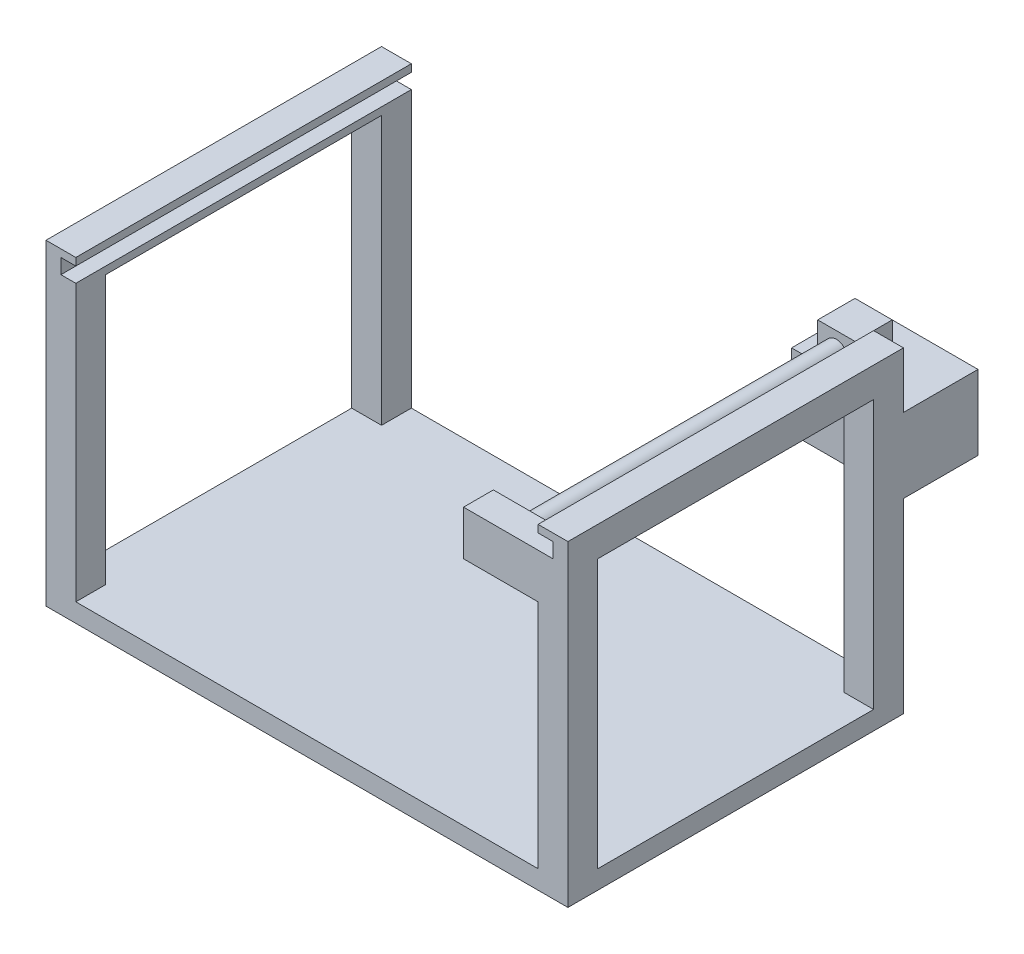
ISO-10303-21;
HEADER;
FILE_DESCRIPTION(('STEP AP214'),'2;1');
FILE_NAME('part.step','',(''),(''),'','','');
FILE_SCHEMA(('AUTOMOTIVE_DESIGN { 1 0 10303 214 1 1 1 1 }'));
ENDSEC;
DATA;
#1=APPLICATION_CONTEXT('core data for automotive mechanical design processes');
#2=APPLICATION_PROTOCOL_DEFINITION('international standard','automotive_design',2000,#1);
#3=PRODUCT_CONTEXT('',#1,'mechanical');
#4=PRODUCT('Part','Part','',(#3));
#5=PRODUCT_RELATED_PRODUCT_CATEGORY('part','',(#4));
#6=PRODUCT_DEFINITION_FORMATION('','',#4);
#7=PRODUCT_DEFINITION_CONTEXT('part definition',#1,'design');
#8=PRODUCT_DEFINITION('design','',#6,#7);
#9=PRODUCT_DEFINITION_SHAPE('','',#8);
#10=(LENGTH_UNIT() NAMED_UNIT(*) SI_UNIT(.MILLI.,.METRE.));
#11=(NAMED_UNIT(*) PLANE_ANGLE_UNIT() SI_UNIT($,.RADIAN.));
#12=(NAMED_UNIT(*) SI_UNIT($,.STERADIAN.) SOLID_ANGLE_UNIT());
#13=UNCERTAINTY_MEASURE_WITH_UNIT(LENGTH_MEASURE(1.E-05),#10,'distance_accuracy_value','');
#14=(GEOMETRIC_REPRESENTATION_CONTEXT(3) GLOBAL_UNCERTAINTY_ASSIGNED_CONTEXT((#13)) GLOBAL_UNIT_ASSIGNED_CONTEXT((#10,
#11,#12)) REPRESENTATION_CONTEXT('',''));
#15=CARTESIAN_POINT('',(0.,0.,0.));
#16=DIRECTION('',(0.,0.,1.));
#17=DIRECTION('',(1.,0.,0.));
#18=AXIS2_PLACEMENT_3D('',#15,#16,#17);
#19=CARTESIAN_POINT('',(132.,85.,-90.));
#20=DIRECTION('',(1.,0.,0.));
#21=DIRECTION('',(0.,0.,-1.));
#22=AXIS2_PLACEMENT_3D('',#19,#20,#21);
#23=PLANE('',#22);
#24=DIRECTION('',(0.,-1.,0.));
#25=VECTOR('',#24,1.);
#26=CARTESIAN_POINT('',(132.,79.,-8.));
#27=LINE('',#26,#25);
#28=CARTESIAN_POINT('',(132.,79.,-8.));
#29=VERTEX_POINT('',#28);
#30=CARTESIAN_POINT('',(132.,77.,-8.));
#31=VERTEX_POINT('',#30);
#32=EDGE_CURVE('E297',#29,#31,#27,.T.);
#33=ORIENTED_EDGE('',*,*,#32,.F.);
#34=DIRECTION('',(0.,0.,1.));
#35=VECTOR('',#34,1.);
#36=CARTESIAN_POINT('',(132.,79.,-95.6568542494924));
#37=LINE('',#36,#35);
#38=CARTESIAN_POINT('',(132.,79.,-90.));
#39=VERTEX_POINT('',#38);
#40=EDGE_CURVE('E411',#39,#29,#37,.T.);
#41=ORIENTED_EDGE('',*,*,#40,.F.);
#42=DIRECTION('',(0.,-1.,0.));
#43=VECTOR('',#42,1.);
#44=CARTESIAN_POINT('',(132.,85.,-90.));
#45=LINE('',#44,#43);
#46=CARTESIAN_POINT('',(132.,70.,-90.));
#47=VERTEX_POINT('',#46);
#48=EDGE_CURVE('E471',#39,#47,#45,.T.);
#49=ORIENTED_EDGE('',*,*,#48,.T.);
#50=CARTESIAN_POINT('',(132.,50.,-90.));
#51=VERTEX_POINT('',#50);
#52=EDGE_CURVE('E624',#47,#51,#45,.T.);
#53=ORIENTED_EDGE('',*,*,#52,.T.);
#54=CARTESIAN_POINT('',(132.,5.,-90.));
#55=VERTEX_POINT('',#54);
#56=EDGE_CURVE('E466',#51,#55,#45,.T.);
#57=ORIENTED_EDGE('',*,*,#56,.T.);
#58=DIRECTION('',(0.,0.,1.));
#59=VECTOR('',#58,1.);
#60=CARTESIAN_POINT('',(132.,5.,-90.));
#61=LINE('',#60,#59);
#62=CARTESIAN_POINT('',(132.,5.,-82.));
#63=VERTEX_POINT('',#62);
#64=EDGE_CURVE('E449',#55,#63,#61,.T.);
#65=ORIENTED_EDGE('',*,*,#64,.T.);
#66=DIRECTION('',(0.,-1.,0.));
#67=VECTOR('',#66,1.);
#68=CARTESIAN_POINT('',(132.,85.,-82.));
#69=LINE('',#68,#67);
#70=CARTESIAN_POINT('',(132.,77.,-82.));
#71=VERTEX_POINT('',#70);
#72=EDGE_CURVE('E464',#71,#63,#69,.T.);
#73=ORIENTED_EDGE('',*,*,#72,.F.);
#74=DIRECTION('',(0.,0.,-1.));
#75=VECTOR('',#74,1.);
#76=CARTESIAN_POINT('',(132.,77.,0.002000000000002));
#77=LINE('',#76,#75);
#78=EDGE_CURVE('E421',#31,#71,#77,.T.);
#79=ORIENTED_EDGE('',*,*,#78,.F.);
#80=EDGE_LOOP('',(#33,#41,#49,#53,#57,#65,#73,#79));
#81=FACE_BOUND('',#80,.T.);
#82=ADVANCED_FACE('F35',(#81),#23,.F.);
#83=CARTESIAN_POINT('',(0.,0.,-90.));
#84=DIRECTION('',(0.,0.,1.));
#85=DIRECTION('',(1.,0.,0.));
#86=AXIS2_PLACEMENT_3D('',#83,#84,#85);
#87=PLANE('',#86);
#88=DIRECTION('',(-1.,0.,0.));
#89=VECTOR('',#88,1.);
#90=CARTESIAN_POINT('',(140.,50.,-90.));
#91=LINE('',#90,#89);
#92=CARTESIAN_POINT('',(140.,50.,-90.));
#93=VERTEX_POINT('',#92);
#94=EDGE_CURVE('E350',#93,#51,#91,.T.);
#95=ORIENTED_EDGE('',*,*,#94,.F.);
#96=DIRECTION('',(0.,1.,0.));
#97=VECTOR('',#96,1.);
#98=CARTESIAN_POINT('',(140.,0.,-90.));
#99=LINE('',#98,#97);
#100=CARTESIAN_POINT('',(140.,0.,-90.));
#101=VERTEX_POINT('',#100);
#102=EDGE_CURVE('E515',#101,#93,#99,.T.);
#103=ORIENTED_EDGE('',*,*,#102,.F.);
#104=DIRECTION('',(1.,0.,0.));
#105=VECTOR('',#104,1.);
#106=CARTESIAN_POINT('',(0.,0.,-90.));
#107=LINE('',#106,#105);
#108=CARTESIAN_POINT('',(0.,0.,-90.));
#109=VERTEX_POINT('',#108);
#110=EDGE_CURVE('E518',#109,#101,#107,.T.);
#111=ORIENTED_EDGE('',*,*,#110,.F.);
#112=DIRECTION('',(0.,1.,0.));
#113=VECTOR('',#112,1.);
#114=CARTESIAN_POINT('',(0.,0.,-90.));
#115=LINE('',#114,#113);
#116=CARTESIAN_POINT('',(0.,85.,-90.));
#117=VERTEX_POINT('',#116);
#118=EDGE_CURVE('E521',#109,#117,#115,.T.);
#119=ORIENTED_EDGE('',*,*,#118,.T.);
#120=DIRECTION('',(-1.,0.,0.));
#121=VECTOR('',#120,1.);
#122=CARTESIAN_POINT('',(0.,85.,-90.));
#123=LINE('',#122,#121);
#124=CARTESIAN_POINT('',(8.,85.,-90.));
#125=VERTEX_POINT('',#124);
#126=EDGE_CURVE('E472',#125,#117,#123,.T.);
#127=ORIENTED_EDGE('',*,*,#126,.F.);
#128=DIRECTION('',(0.,-1.,0.));
#129=VECTOR('',#128,1.);
#130=CARTESIAN_POINT('',(8.,85.,-90.));
#131=LINE('',#130,#129);
#132=CARTESIAN_POINT('',(8.,83.,-90.));
#133=VERTEX_POINT('',#132);
#134=EDGE_CURVE('E481',#125,#133,#131,.T.);
#135=ORIENTED_EDGE('',*,*,#134,.T.);
#136=DIRECTION('',(1.,0.,0.));
#137=VECTOR('',#136,1.);
#138=CARTESIAN_POINT('',(8.,83.,-90.));
#139=LINE('',#138,#137);
#140=CARTESIAN_POINT('',(4.,83.,-90.));
#141=VERTEX_POINT('',#140);
#142=EDGE_CURVE('E374',#141,#133,#139,.T.);
#143=ORIENTED_EDGE('',*,*,#142,.F.);
#144=DIRECTION('',(0.,1.,0.));
#145=VECTOR('',#144,1.);
#146=CARTESIAN_POINT('',(4.,83.,-90.));
#147=LINE('',#146,#145);
#148=CARTESIAN_POINT('',(4.,79.,-90.));
#149=VERTEX_POINT('',#148);
#150=EDGE_CURVE('E369',#149,#141,#147,.T.);
#151=ORIENTED_EDGE('',*,*,#150,.F.);
#152=DIRECTION('',(-1.,0.,0.));
#153=VECTOR('',#152,1.);
#154=CARTESIAN_POINT('',(8.,79.,-90.));
#155=LINE('',#154,#153);
#156=CARTESIAN_POINT('',(8.,79.,-90.));
#157=VERTEX_POINT('',#156);
#158=EDGE_CURVE('E371',#157,#149,#155,.T.);
#159=ORIENTED_EDGE('',*,*,#158,.F.);
#160=CARTESIAN_POINT('',(8.,5.,-90.));
#161=VERTEX_POINT('',#160);
#162=EDGE_CURVE('E475',#157,#161,#131,.T.);
#163=ORIENTED_EDGE('',*,*,#162,.T.);
#164=DIRECTION('',(1.,0.,0.));
#165=VECTOR('',#164,1.);
#166=CARTESIAN_POINT('',(0.,5.,-90.));
#167=LINE('',#166,#165);
#168=EDGE_CURVE('E510',#161,#55,#167,.T.);
#169=ORIENTED_EDGE('',*,*,#168,.T.);
#170=ORIENTED_EDGE('',*,*,#56,.F.);
#171=EDGE_LOOP('',(#95,#103,#111,#119,#127,#135,#143,#151,#159,#163,#169,#170));
#172=FACE_BOUND('',#171,.T.);
#173=ADVANCED_FACE('F558',(#172),#87,.F.);
#174=CARTESIAN_POINT('',(8.,85.,0.));
#175=DIRECTION('',(-1.,0.,0.));
#176=DIRECTION('',(0.,0.,1.));
#177=AXIS2_PLACEMENT_3D('',#174,#175,#176);
#178=PLANE('',#177);
#179=ORIENTED_EDGE('',*,*,#162,.F.);
#180=DIRECTION('',(0.,0.,1.));
#181=VECTOR('',#180,1.);
#182=CARTESIAN_POINT('',(8.,79.,-95.6568542494924));
#183=LINE('',#182,#181);
#184=CARTESIAN_POINT('',(8.,79.,0.));
#185=VERTEX_POINT('',#184);
#186=EDGE_CURVE('E372',#157,#185,#183,.T.);
#187=ORIENTED_EDGE('',*,*,#186,.T.);
#188=DIRECTION('',(0.,-1.,0.));
#189=VECTOR('',#188,1.);
#190=CARTESIAN_POINT('',(8.,85.,0.));
#191=LINE('',#190,#189);
#192=CARTESIAN_POINT('',(8.,5.,0.));
#193=VERTEX_POINT('',#192);
#194=EDGE_CURVE('E505',#185,#193,#191,.T.);
#195=ORIENTED_EDGE('',*,*,#194,.T.);
#196=DIRECTION('',(0.,0.,-1.));
#197=VECTOR('',#196,1.);
#198=CARTESIAN_POINT('',(8.,5.,0.));
#199=LINE('',#198,#197);
#200=CARTESIAN_POINT('',(8.,5.,-8.));
#201=VERTEX_POINT('',#200);
#202=EDGE_CURVE('E488',#193,#201,#199,.T.);
#203=ORIENTED_EDGE('',*,*,#202,.T.);
#204=DIRECTION('',(0.,-1.,0.));
#205=VECTOR('',#204,1.);
#206=CARTESIAN_POINT('',(8.,85.,-8.));
#207=LINE('',#206,#205);
#208=CARTESIAN_POINT('',(8.,77.,-8.));
#209=VERTEX_POINT('',#208);
#210=EDGE_CURVE('E503',#209,#201,#207,.T.);
#211=ORIENTED_EDGE('',*,*,#210,.F.);
#212=DIRECTION('',(0.,0.,-1.));
#213=VECTOR('',#212,1.);
#214=CARTESIAN_POINT('',(8.,77.,0.002000000000002));
#215=LINE('',#214,#213);
#216=CARTESIAN_POINT('',(8.,77.,-82.));
#217=VERTEX_POINT('',#216);
#218=EDGE_CURVE('E427',#209,#217,#215,.T.);
#219=ORIENTED_EDGE('',*,*,#218,.T.);
#220=DIRECTION('',(0.,-1.,0.));
#221=VECTOR('',#220,1.);
#222=CARTESIAN_POINT('',(8.,85.,-82.));
#223=LINE('',#222,#221);
#224=CARTESIAN_POINT('',(8.,5.,-82.));
#225=VERTEX_POINT('',#224);
#226=EDGE_CURVE('E484',#217,#225,#223,.T.);
#227=ORIENTED_EDGE('',*,*,#226,.T.);
#228=DIRECTION('',(0.,0.,-1.));
#229=VECTOR('',#228,1.);
#230=CARTESIAN_POINT('',(8.,5.,-90.));
#231=LINE('',#230,#229);
#232=EDGE_CURVE('E476',#225,#161,#231,.T.);
#233=ORIENTED_EDGE('',*,*,#232,.T.);
#234=EDGE_LOOP('',(#179,#187,#195,#203,#211,#219,#227,#233));
#235=FACE_BOUND('',#234,.T.);
#236=ADVANCED_FACE('F642',(#235),#178,.F.);
#237=CARTESIAN_POINT('',(132.,85.,-90.));
#238=VERTEX_POINT('',#237);
#239=CARTESIAN_POINT('',(132.,83.,-90.));
#240=VERTEX_POINT('',#239);
#241=EDGE_CURVE('E467',#238,#240,#45,.T.);
#242=ORIENTED_EDGE('',*,*,#241,.T.);
#243=DIRECTION('',(0.,0.,1.));
#244=VECTOR('',#243,1.);
#245=CARTESIAN_POINT('',(132.,83.,-95.6568542494924));
#246=LINE('',#245,#244);
#247=CARTESIAN_POINT('',(132.,83.,0.));
#248=VERTEX_POINT('',#247);
#249=EDGE_CURVE('E407',#240,#248,#246,.T.);
#250=ORIENTED_EDGE('',*,*,#249,.T.);
#251=DIRECTION('',(0.,-1.,0.));
#252=VECTOR('',#251,1.);
#253=CARTESIAN_POINT('',(132.,85.,0.));
#254=LINE('',#253,#252);
#255=CARTESIAN_POINT('',(132.,85.,0.));
#256=VERTEX_POINT('',#255);
#257=EDGE_CURVE('E443',#256,#248,#254,.T.);
#258=ORIENTED_EDGE('',*,*,#257,.F.);
#259=DIRECTION('',(0.,0.,1.));
#260=VECTOR('',#259,1.);
#261=CARTESIAN_POINT('',(132.,85.,-90.));
#262=LINE('',#261,#260);
#263=EDGE_CURVE('E456',#238,#256,#262,.T.);
#264=ORIENTED_EDGE('',*,*,#263,.F.);
#265=EDGE_LOOP('',(#242,#250,#258,#264));
#266=FACE_BOUND('',#265,.T.);
#267=ADVANCED_FACE('F586',(#266),#23,.F.);
#268=CARTESIAN_POINT('',(140.,85.,-82.));
#269=DIRECTION('',(0.,0.,-1.));
#270=DIRECTION('',(-1.,0.,0.));
#271=AXIS2_PLACEMENT_3D('',#268,#269,#270);
#272=PLANE('',#271);
#273=DIRECTION('',(1.,0.,0.));
#274=VECTOR('',#273,1.);
#275=CARTESIAN_POINT('',(132.,77.,-82.));
#276=LINE('',#275,#274);
#277=CARTESIAN_POINT('',(140.,77.,-82.));
#278=VERTEX_POINT('',#277);
#279=EDGE_CURVE('E416',#71,#278,#276,.T.);
#280=ORIENTED_EDGE('',*,*,#279,.F.);
#281=ORIENTED_EDGE('',*,*,#72,.T.);
#282=DIRECTION('',(1.,0.,0.));
#283=VECTOR('',#282,1.);
#284=CARTESIAN_POINT('',(140.,5.,-82.));
#285=LINE('',#284,#283);
#286=CARTESIAN_POINT('',(140.,5.,-82.));
#287=VERTEX_POINT('',#286);
#288=EDGE_CURVE('E454',#63,#287,#285,.T.);
#289=ORIENTED_EDGE('',*,*,#288,.T.);
#290=DIRECTION('',(0.,-1.,0.));
#291=VECTOR('',#290,1.);
#292=CARTESIAN_POINT('',(140.,85.,-82.));
#293=LINE('',#292,#291);
#294=EDGE_CURVE('E458',#278,#287,#293,.T.);
#295=ORIENTED_EDGE('',*,*,#294,.F.);
#296=EDGE_LOOP('',(#280,#281,#289,#295));
#297=FACE_BOUND('',#296,.T.);
#298=ADVANCED_FACE('F617',(#297),#272,.F.);
#299=CARTESIAN_POINT('',(140.,85.,-8.));
#300=DIRECTION('',(0.,0.,1.));
#301=DIRECTION('',(1.,0.,0.));
#302=AXIS2_PLACEMENT_3D('',#299,#300,#301);
#303=PLANE('',#302);
#304=DIRECTION('',(1.,0.,0.));
#305=VECTOR('',#304,1.);
#306=CARTESIAN_POINT('',(132.,77.,-8.));
#307=LINE('',#306,#305);
#308=CARTESIAN_POINT('',(140.,77.,-8.00000000000001));
#309=VERTEX_POINT('',#308);
#310=EDGE_CURVE('E393',#31,#309,#307,.T.);
#311=ORIENTED_EDGE('',*,*,#310,.T.);
#312=DIRECTION('',(0.,-1.,0.));
#313=VECTOR('',#312,1.);
#314=CARTESIAN_POINT('',(140.,85.,-8.));
#315=LINE('',#314,#313);
#316=CARTESIAN_POINT('',(140.,5.,-8.00000000000002));
#317=VERTEX_POINT('',#316);
#318=EDGE_CURVE('E447',#309,#317,#315,.T.);
#319=ORIENTED_EDGE('',*,*,#318,.T.);
#320=DIRECTION('',(-1.,0.,0.));
#321=VECTOR('',#320,1.);
#322=CARTESIAN_POINT('',(140.,5.,-8.));
#323=LINE('',#322,#321);
#324=CARTESIAN_POINT('',(132.,5.,-7.99999999999999));
#325=VERTEX_POINT('',#324);
#326=EDGE_CURVE('E434',#317,#325,#323,.T.);
#327=ORIENTED_EDGE('',*,*,#326,.T.);
#328=DIRECTION('',(0.,-1.,0.));
#329=VECTOR('',#328,1.);
#330=CARTESIAN_POINT('',(132.,85.,-8.));
#331=LINE('',#330,#329);
#332=CARTESIAN_POINT('',(132.,67.,-8.));
#333=VERTEX_POINT('',#332);
#334=EDGE_CURVE('E288',#333,#325,#331,.T.);
#335=ORIENTED_EDGE('',*,*,#334,.F.);
#336=DIRECTION('',(1.,0.,0.));
#337=VECTOR('',#336,1.);
#338=CARTESIAN_POINT('',(112.,67.,-8.));
#339=LINE('',#338,#337);
#340=CARTESIAN_POINT('',(112.,67.,-8.));
#341=VERTEX_POINT('',#340);
#342=EDGE_CURVE('E283',#341,#333,#339,.T.);
#343=ORIENTED_EDGE('',*,*,#342,.F.);
#344=DIRECTION('',(0.,-1.,0.));
#345=VECTOR('',#344,1.);
#346=CARTESIAN_POINT('',(112.,79.,-8.));
#347=LINE('',#346,#345);
#348=CARTESIAN_POINT('',(112.,79.,-8.));
#349=VERTEX_POINT('',#348);
#350=EDGE_CURVE('E270',#349,#341,#347,.T.);
#351=ORIENTED_EDGE('',*,*,#350,.F.);
#352=DIRECTION('',(1.,0.,0.));
#353=VECTOR('',#352,1.);
#354=CARTESIAN_POINT('',(112.,79.,-8.));
#355=LINE('',#354,#353);
#356=EDGE_CURVE('E292',#349,#29,#355,.T.);
#357=ORIENTED_EDGE('',*,*,#356,.T.);
#358=ORIENTED_EDGE('',*,*,#32,.T.);
#359=EDGE_LOOP('',(#311,#319,#327,#335,#343,#351,#357,#358));
#360=FACE_BOUND('',#359,.T.);
#361=CARTESIAN_POINT('',(122.,75.,-8.));
#362=DIRECTION('',(0.,0.,1.));
#363=DIRECTION('',(1.,0.,0.));
#364=AXIS2_PLACEMENT_3D('',#361,#362,#363);
#365=CIRCLE('',#364,2.99999999999999);
#366=CARTESIAN_POINT('',(125.,75.,-8.));
#367=VERTEX_POINT('',#366);
#368=EDGE_CURVE('E310',#367,#367,#365,.T.);
#369=ORIENTED_EDGE('',*,*,#368,.T.);
#370=EDGE_LOOP('',(#369));
#371=FACE_BOUND('',#370,.T.);
#372=ADVANCED_FACE('F285',(#360,#371),#303,.F.);
#373=CARTESIAN_POINT('',(0.,85.,-8.));
#374=DIRECTION('',(0.,0.,1.));
#375=DIRECTION('',(1.,0.,0.));
#376=AXIS2_PLACEMENT_3D('',#373,#374,#375);
#377=PLANE('',#376);
#378=DIRECTION('',(1.,0.,0.));
#379=VECTOR('',#378,1.);
#380=CARTESIAN_POINT('',(0.,77.,-8.));
#381=LINE('',#380,#379);
#382=CARTESIAN_POINT('',(0.,77.,-8.));
#383=VERTEX_POINT('',#382);
#384=EDGE_CURVE('E430',#383,#209,#381,.T.);
#385=ORIENTED_EDGE('',*,*,#384,.T.);
#386=ORIENTED_EDGE('',*,*,#210,.T.);
#387=DIRECTION('',(-1.,0.,0.));
#388=VECTOR('',#387,1.);
#389=CARTESIAN_POINT('',(0.,5.,-8.));
#390=LINE('',#389,#388);
#391=CARTESIAN_POINT('',(0.,5.,-8.00000000000004));
#392=VERTEX_POINT('',#391);
#393=EDGE_CURVE('E493',#201,#392,#390,.T.);
#394=ORIENTED_EDGE('',*,*,#393,.T.);
#395=DIRECTION('',(0.,-1.,0.));
#396=VECTOR('',#395,1.);
#397=CARTESIAN_POINT('',(0.,85.,-8.));
#398=LINE('',#397,#396);
#399=EDGE_CURVE('E497',#383,#392,#398,.T.);
#400=ORIENTED_EDGE('',*,*,#399,.F.);
#401=EDGE_LOOP('',(#385,#386,#394,#400));
#402=FACE_BOUND('',#401,.T.);
#403=ADVANCED_FACE('F664',(#402),#377,.F.);
#404=CARTESIAN_POINT('',(0.,85.,-82.));
#405=DIRECTION('',(0.,0.,-1.));
#406=DIRECTION('',(-1.,0.,0.));
#407=AXIS2_PLACEMENT_3D('',#404,#405,#406);
#408=PLANE('',#407);
#409=DIRECTION('',(1.,0.,0.));
#410=VECTOR('',#409,1.);
#411=CARTESIAN_POINT('',(0.,77.,-82.));
#412=LINE('',#411,#410);
#413=CARTESIAN_POINT('',(0.,77.,-82.));
#414=VERTEX_POINT('',#413);
#415=EDGE_CURVE('E419',#414,#217,#412,.T.);
#416=ORIENTED_EDGE('',*,*,#415,.F.);
#417=DIRECTION('',(0.,-1.,0.));
#418=VECTOR('',#417,1.);
#419=CARTESIAN_POINT('',(0.,85.,-82.));
#420=LINE('',#419,#418);
#421=CARTESIAN_POINT('',(0.,5.,-82.));
#422=VERTEX_POINT('',#421);
#423=EDGE_CURVE('E486',#414,#422,#420,.T.);
#424=ORIENTED_EDGE('',*,*,#423,.T.);
#425=DIRECTION('',(1.,0.,0.));
#426=VECTOR('',#425,1.);
#427=CARTESIAN_POINT('',(0.,5.,-82.));
#428=LINE('',#427,#426);
#429=EDGE_CURVE('E470',#422,#225,#428,.T.);
#430=ORIENTED_EDGE('',*,*,#429,.T.);
#431=ORIENTED_EDGE('',*,*,#226,.F.);
#432=EDGE_LOOP('',(#416,#424,#430,#431));
#433=FACE_BOUND('',#432,.T.);
#434=ADVANCED_FACE('F663',(#433),#408,.F.);
#435=CARTESIAN_POINT('',(0.,5.,-90.));
#436=DIRECTION('',(0.,-1.,0.));
#437=DIRECTION('',(0.,0.,-1.));
#438=AXIS2_PLACEMENT_3D('',#435,#436,#437);
#439=PLANE('',#438);
#440=ORIENTED_EDGE('',*,*,#326,.F.);
#441=DIRECTION('',(0.,0.,1.));
#442=VECTOR('',#441,1.);
#443=CARTESIAN_POINT('',(140.,5.,-90.));
#444=LINE('',#443,#442);
#445=EDGE_CURVE('E11',#287,#317,#444,.T.);
#446=ORIENTED_EDGE('',*,*,#445,.F.);
#447=ORIENTED_EDGE('',*,*,#288,.F.);
#448=ORIENTED_EDGE('',*,*,#64,.F.);
#449=ORIENTED_EDGE('',*,*,#168,.F.);
#450=ORIENTED_EDGE('',*,*,#232,.F.);
#451=ORIENTED_EDGE('',*,*,#429,.F.);
#452=DIRECTION('',(0.,0.,1.));
#453=VECTOR('',#452,1.);
#454=CARTESIAN_POINT('',(0.,5.,-90.));
#455=LINE('',#454,#453);
#456=EDGE_CURVE('E524',#422,#392,#455,.T.);
#457=ORIENTED_EDGE('',*,*,#456,.T.);
#458=ORIENTED_EDGE('',*,*,#393,.F.);
#459=ORIENTED_EDGE('',*,*,#202,.F.);
#460=DIRECTION('',(1.,0.,0.));
#461=VECTOR('',#460,1.);
#462=CARTESIAN_POINT('',(0.,5.,0.));
#463=LINE('',#462,#461);
#464=CARTESIAN_POINT('',(132.,5.,0.));
#465=VERTEX_POINT('',#464);
#466=EDGE_CURVE('E509',#193,#465,#463,.T.);
#467=ORIENTED_EDGE('',*,*,#466,.T.);
#468=DIRECTION('',(0.,0.,1.));
#469=VECTOR('',#468,1.);
#470=CARTESIAN_POINT('',(132.,5.,0.));
#471=LINE('',#470,#469);
#472=EDGE_CURVE('E439',#325,#465,#471,.T.);
#473=ORIENTED_EDGE('',*,*,#472,.F.);
#474=EDGE_LOOP('',(#440,#446,#447,#448,#449,#450,#451,#457,#458,#459,#467,#473));
#475=FACE_BOUND('',#474,.T.);
#476=ADVANCED_FACE('F37',(#475),#439,.F.);
#477=CARTESIAN_POINT('',(140.,0.,-90.));
#478=DIRECTION('',(1.,0.,0.));
#479=DIRECTION('',(0.,0.,-1.));
#480=AXIS2_PLACEMENT_3D('',#477,#478,#479);
#481=PLANE('',#480);
#482=DIRECTION('',(0.,0.,-1.));
#483=VECTOR('',#482,1.);
#484=CARTESIAN_POINT('',(140.,77.,0.002000000000002));
#485=LINE('',#484,#483);
#486=EDGE_CURVE('E420',#309,#278,#485,.T.);
#487=ORIENTED_EDGE('',*,*,#486,.T.);
#488=ORIENTED_EDGE('',*,*,#294,.T.);
#489=ORIENTED_EDGE('',*,*,#445,.T.);
#490=ORIENTED_EDGE('',*,*,#318,.F.);
#491=EDGE_LOOP('',(#487,#488,#489,#490));
#492=FACE_BOUND('',#491,.T.);
#493=DIRECTION('',(0.,1.,0.));
#494=VECTOR('',#493,1.);
#495=CARTESIAN_POINT('',(140.,0.,0.));
#496=LINE('',#495,#494);
#497=CARTESIAN_POINT('',(140.,0.,0.));
#498=VERTEX_POINT('',#497);
#499=CARTESIAN_POINT('',(140.,85.,0.));
#500=VERTEX_POINT('',#499);
#501=EDGE_CURVE('E527',#498,#500,#496,.T.);
#502=ORIENTED_EDGE('',*,*,#501,.F.);
#503=DIRECTION('',(0.,0.,1.));
#504=VECTOR('',#503,1.);
#505=CARTESIAN_POINT('',(140.,0.,-90.));
#506=LINE('',#505,#504);
#507=EDGE_CURVE('E43',#101,#498,#506,.T.);
#508=ORIENTED_EDGE('',*,*,#507,.F.);
#509=ORIENTED_EDGE('',*,*,#102,.T.);
#510=DIRECTION('',(0.,0.,1.));
#511=VECTOR('',#510,1.);
#512=CARTESIAN_POINT('',(140.,50.,-110.));
#513=LINE('',#512,#511);
#514=CARTESIAN_POINT('',(140.,50.,-110.));
#515=VERTEX_POINT('',#514);
#516=EDGE_CURVE('E349',#515,#93,#513,.T.);
#517=ORIENTED_EDGE('',*,*,#516,.F.);
#518=DIRECTION('',(0.,-1.,0.));
#519=VECTOR('',#518,1.);
#520=CARTESIAN_POINT('',(140.,70.,-110.));
#521=LINE('',#520,#519);
#522=CARTESIAN_POINT('',(140.,70.,-110.));
#523=VERTEX_POINT('',#522);
#524=EDGE_CURVE('E347',#523,#515,#521,.T.);
#525=ORIENTED_EDGE('',*,*,#524,.F.);
#526=DIRECTION('',(0.,0.,1.));
#527=VECTOR('',#526,1.);
#528=CARTESIAN_POINT('',(140.,70.,-110.));
#529=LINE('',#528,#527);
#530=CARTESIAN_POINT('',(140.,70.,-90.));
#531=VERTEX_POINT('',#530);
#532=EDGE_CURVE('E360',#523,#531,#529,.T.);
#533=ORIENTED_EDGE('',*,*,#532,.T.);
#534=CARTESIAN_POINT('',(140.,85.,-90.));
#535=VERTEX_POINT('',#534);
#536=EDGE_CURVE('E513',#531,#535,#99,.T.);
#537=ORIENTED_EDGE('',*,*,#536,.T.);
#538=DIRECTION('',(0.,0.,-1.));
#539=VECTOR('',#538,1.);
#540=CARTESIAN_POINT('',(140.,85.,-90.));
#541=LINE('',#540,#539);
#542=EDGE_CURVE('E450',#500,#535,#541,.T.);
#543=ORIENTED_EDGE('',*,*,#542,.F.);
#544=EDGE_LOOP('',(#502,#508,#509,#517,#525,#533,#537,#543));
#545=FACE_BOUND('',#544,.T.);
#546=ADVANCED_FACE('F544',(#492,#545),#481,.T.);
#547=CARTESIAN_POINT('',(0.,0.,-90.));
#548=DIRECTION('',(0.,-1.,0.));
#549=DIRECTION('',(0.,0.,-1.));
#550=AXIS2_PLACEMENT_3D('',#547,#548,#549);
#551=PLANE('',#550);
#552=DIRECTION('',(1.,0.,0.));
#553=VECTOR('',#552,1.);
#554=CARTESIAN_POINT('',(0.,0.,0.));
#555=LINE('',#554,#553);
#556=CARTESIAN_POINT('',(0.,0.,0.));
#557=VERTEX_POINT('',#556);
#558=EDGE_CURVE('E530',#557,#498,#555,.T.);
#559=ORIENTED_EDGE('',*,*,#558,.F.);
#560=DIRECTION('',(0.,0.,1.));
#561=VECTOR('',#560,1.);
#562=CARTESIAN_POINT('',(0.,0.,-90.));
#563=LINE('',#562,#561);
#564=EDGE_CURVE('E536',#109,#557,#563,.T.);
#565=ORIENTED_EDGE('',*,*,#564,.F.);
#566=ORIENTED_EDGE('',*,*,#110,.T.);
#567=ORIENTED_EDGE('',*,*,#507,.T.);
#568=EDGE_LOOP('',(#559,#565,#566,#567));
#569=FACE_BOUND('',#568,.T.);
#570=ADVANCED_FACE('F540',(#569),#551,.T.);
#571=CARTESIAN_POINT('',(0.,0.,-90.));
#572=DIRECTION('',(1.,0.,0.));
#573=DIRECTION('',(0.,0.,-1.));
#574=AXIS2_PLACEMENT_3D('',#571,#572,#573);
#575=PLANE('',#574);
#576=DIRECTION('',(0.,0.,-1.));
#577=VECTOR('',#576,1.);
#578=CARTESIAN_POINT('',(0.,77.,0.002000000000002));
#579=LINE('',#578,#577);
#580=EDGE_CURVE('E428',#383,#414,#579,.T.);
#581=ORIENTED_EDGE('',*,*,#580,.F.);
#582=ORIENTED_EDGE('',*,*,#399,.T.);
#583=ORIENTED_EDGE('',*,*,#456,.F.);
#584=ORIENTED_EDGE('',*,*,#423,.F.);
#585=EDGE_LOOP('',(#581,#582,#583,#584));
#586=FACE_BOUND('',#585,.T.);
#587=DIRECTION('',(0.,1.,0.));
#588=VECTOR('',#587,1.);
#589=CARTESIAN_POINT('',(0.,0.,0.));
#590=LINE('',#589,#588);
#591=CARTESIAN_POINT('',(0.,85.,0.));
#592=VERTEX_POINT('',#591);
#593=EDGE_CURVE('E514',#557,#592,#590,.T.);
#594=ORIENTED_EDGE('',*,*,#593,.T.);
#595=DIRECTION('',(0.,0.,1.));
#596=VECTOR('',#595,1.);
#597=CARTESIAN_POINT('',(0.,85.,0.));
#598=LINE('',#597,#596);
#599=EDGE_CURVE('E489',#117,#592,#598,.T.);
#600=ORIENTED_EDGE('',*,*,#599,.F.);
#601=ORIENTED_EDGE('',*,*,#118,.F.);
#602=ORIENTED_EDGE('',*,*,#564,.T.);
#603=EDGE_LOOP('',(#594,#600,#601,#602));
#604=FACE_BOUND('',#603,.T.);
#605=ADVANCED_FACE('F553',(#586,#604),#575,.F.);
#606=ORIENTED_EDGE('',*,*,#536,.F.);
#607=DIRECTION('',(-1.,0.,0.));
#608=VECTOR('',#607,1.);
#609=CARTESIAN_POINT('',(140.,70.,-90.));
#610=LINE('',#609,#608);
#611=EDGE_CURVE('E341',#531,#47,#610,.T.);
#612=ORIENTED_EDGE('',*,*,#611,.T.);
#613=ORIENTED_EDGE('',*,*,#48,.F.);
#614=DIRECTION('',(-1.,0.,0.));
#615=VECTOR('',#614,1.);
#616=CARTESIAN_POINT('',(132.,79.,-90.));
#617=LINE('',#616,#615);
#618=CARTESIAN_POINT('',(136.,79.,-90.));
#619=VERTEX_POINT('',#618);
#620=EDGE_CURVE('E394',#619,#39,#617,.T.);
#621=ORIENTED_EDGE('',*,*,#620,.F.);
#622=DIRECTION('',(0.,-1.,0.));
#623=VECTOR('',#622,1.);
#624=CARTESIAN_POINT('',(136.,83.,-90.));
#625=LINE('',#624,#623);
#626=CARTESIAN_POINT('',(136.,83.,-90.));
#627=VERTEX_POINT('',#626);
#628=EDGE_CURVE('E396',#627,#619,#625,.T.);
#629=ORIENTED_EDGE('',*,*,#628,.F.);
#630=DIRECTION('',(1.,0.,0.));
#631=VECTOR('',#630,1.);
#632=CARTESIAN_POINT('',(132.,83.,-90.));
#633=LINE('',#632,#631);
#634=EDGE_CURVE('E379',#240,#627,#633,.T.);
#635=ORIENTED_EDGE('',*,*,#634,.F.);
#636=ORIENTED_EDGE('',*,*,#241,.F.);
#637=DIRECTION('',(-1.,0.,0.));
#638=VECTOR('',#637,1.);
#639=CARTESIAN_POINT('',(140.,85.,-90.));
#640=LINE('',#639,#638);
#641=EDGE_CURVE('E453',#535,#238,#640,.T.);
#642=ORIENTED_EDGE('',*,*,#641,.F.);
#643=EDGE_LOOP('',(#606,#612,#613,#621,#629,#635,#636,#642));
#644=FACE_BOUND('',#643,.T.);
#645=ADVANCED_FACE('F577',(#644),#87,.F.);
#646=CARTESIAN_POINT('',(0.,0.,0.));
#647=DIRECTION('',(0.,0.,1.));
#648=DIRECTION('',(1.,0.,0.));
#649=AXIS2_PLACEMENT_3D('',#646,#647,#648);
#650=PLANE('',#649);
#651=DIRECTION('',(1.,0.,0.));
#652=VECTOR('',#651,1.);
#653=CARTESIAN_POINT('',(8.,79.,0.));
#654=LINE('',#653,#652);
#655=CARTESIAN_POINT('',(4.,79.,0.));
#656=VERTEX_POINT('',#655);
#657=EDGE_CURVE('E382',#656,#185,#654,.T.);
#658=ORIENTED_EDGE('',*,*,#657,.F.);
#659=DIRECTION('',(0.,-1.,0.));
#660=VECTOR('',#659,1.);
#661=CARTESIAN_POINT('',(4.,83.,0.));
#662=LINE('',#661,#660);
#663=CARTESIAN_POINT('',(4.,83.,0.));
#664=VERTEX_POINT('',#663);
#665=EDGE_CURVE('E378',#664,#656,#662,.T.);
#666=ORIENTED_EDGE('',*,*,#665,.F.);
#667=DIRECTION('',(-1.,0.,0.));
#668=VECTOR('',#667,1.);
#669=CARTESIAN_POINT('',(8.,83.,0.));
#670=LINE('',#669,#668);
#671=CARTESIAN_POINT('',(8.,83.,0.));
#672=VERTEX_POINT('',#671);
#673=EDGE_CURVE('E375',#672,#664,#670,.T.);
#674=ORIENTED_EDGE('',*,*,#673,.F.);
#675=CARTESIAN_POINT('',(8.,85.,0.));
#676=VERTEX_POINT('',#675);
#677=EDGE_CURVE('E506',#676,#672,#191,.T.);
#678=ORIENTED_EDGE('',*,*,#677,.F.);
#679=DIRECTION('',(1.,0.,0.));
#680=VECTOR('',#679,1.);
#681=CARTESIAN_POINT('',(0.,85.,0.));
#682=LINE('',#681,#680);
#683=EDGE_CURVE('E492',#592,#676,#682,.T.);
#684=ORIENTED_EDGE('',*,*,#683,.F.);
#685=ORIENTED_EDGE('',*,*,#593,.F.);
#686=ORIENTED_EDGE('',*,*,#558,.T.);
#687=ORIENTED_EDGE('',*,*,#501,.T.);
#688=DIRECTION('',(1.,0.,0.));
#689=VECTOR('',#688,1.);
#690=CARTESIAN_POINT('',(140.,85.,0.));
#691=LINE('',#690,#689);
#692=EDGE_CURVE('E435',#256,#500,#691,.T.);
#693=ORIENTED_EDGE('',*,*,#692,.F.);
#694=ORIENTED_EDGE('',*,*,#257,.T.);
#695=DIRECTION('',(-1.,0.,0.));
#696=VECTOR('',#695,1.);
#697=CARTESIAN_POINT('',(132.,83.,0.));
#698=LINE('',#697,#696);
#699=CARTESIAN_POINT('',(136.,83.,0.));
#700=VERTEX_POINT('',#699);
#701=EDGE_CURVE('E368',#700,#248,#698,.T.);
#702=ORIENTED_EDGE('',*,*,#701,.F.);
#703=DIRECTION('',(0.,1.,0.));
#704=VECTOR('',#703,1.);
#705=CARTESIAN_POINT('',(136.,83.,0.));
#706=LINE('',#705,#704);
#707=CARTESIAN_POINT('',(136.,79.,0.));
#708=VERTEX_POINT('',#707);
#709=EDGE_CURVE('E404',#708,#700,#706,.T.);
#710=ORIENTED_EDGE('',*,*,#709,.F.);
#711=DIRECTION('',(1.,0.,0.));
#712=VECTOR('',#711,1.);
#713=CARTESIAN_POINT('',(132.,79.,0.));
#714=LINE('',#713,#712);
#715=CARTESIAN_POINT('',(112.,79.,0.));
#716=VERTEX_POINT('',#715);
#717=EDGE_CURVE('E401',#716,#708,#714,.T.);
#718=ORIENTED_EDGE('',*,*,#717,.F.);
#719=DIRECTION('',(0.,-1.,0.));
#720=VECTOR('',#719,1.);
#721=CARTESIAN_POINT('',(112.,79.,0.));
#722=LINE('',#721,#720);
#723=CARTESIAN_POINT('',(112.,67.,0.));
#724=VERTEX_POINT('',#723);
#725=EDGE_CURVE('E293',#716,#724,#722,.T.);
#726=ORIENTED_EDGE('',*,*,#725,.T.);
#727=DIRECTION('',(1.,0.,0.));
#728=VECTOR('',#727,1.);
#729=CARTESIAN_POINT('',(112.,67.,0.));
#730=LINE('',#729,#728);
#731=CARTESIAN_POINT('',(132.,67.,0.));
#732=VERTEX_POINT('',#731);
#733=EDGE_CURVE('E296',#724,#732,#730,.T.);
#734=ORIENTED_EDGE('',*,*,#733,.T.);
#735=EDGE_CURVE('E438',#732,#465,#254,.T.);
#736=ORIENTED_EDGE('',*,*,#735,.T.);
#737=ORIENTED_EDGE('',*,*,#466,.F.);
#738=ORIENTED_EDGE('',*,*,#194,.F.);
#739=EDGE_LOOP('',(#658,#666,#674,#678,#684,#685,#686,#687,#693,#694,#702,#710,#718,#726,#734,
#736,#737,#738));
#740=FACE_BOUND('',#739,.T.);
#741=ADVANCED_FACE('F549',(#740),#650,.T.);
#742=ORIENTED_EDGE('',*,*,#677,.T.);
#743=DIRECTION('',(0.,0.,1.));
#744=VECTOR('',#743,1.);
#745=CARTESIAN_POINT('',(8.,83.,-95.6568542494924));
#746=LINE('',#745,#744);
#747=EDGE_CURVE('E384',#133,#672,#746,.T.);
#748=ORIENTED_EDGE('',*,*,#747,.F.);
#749=ORIENTED_EDGE('',*,*,#134,.F.);
#750=DIRECTION('',(0.,0.,-1.));
#751=VECTOR('',#750,1.);
#752=CARTESIAN_POINT('',(8.,85.,0.));
#753=LINE('',#752,#751);
#754=EDGE_CURVE('E495',#676,#125,#753,.T.);
#755=ORIENTED_EDGE('',*,*,#754,.F.);
#756=EDGE_LOOP('',(#742,#748,#749,#755));
#757=FACE_BOUND('',#756,.T.);
#758=ADVANCED_FACE('F654',(#757),#178,.F.);
#759=CARTESIAN_POINT('',(0.,85.,0.));
#760=DIRECTION('',(0.,-1.,0.));
#761=DIRECTION('',(0.,0.,-1.));
#762=AXIS2_PLACEMENT_3D('',#759,#760,#761);
#763=PLANE('',#762);
#764=ORIENTED_EDGE('',*,*,#599,.T.);
#765=ORIENTED_EDGE('',*,*,#683,.T.);
#766=ORIENTED_EDGE('',*,*,#754,.T.);
#767=ORIENTED_EDGE('',*,*,#126,.T.);
#768=EDGE_LOOP('',(#764,#765,#766,#767));
#769=FACE_BOUND('',#768,.T.);
#770=ADVANCED_FACE('F648',(#769),#763,.F.);
#771=ORIENTED_EDGE('',*,*,#735,.F.);
#772=DIRECTION('',(0.,0.,-1.));
#773=VECTOR('',#772,1.);
#774=CARTESIAN_POINT('',(132.,67.,0.));
#775=LINE('',#774,#773);
#776=EDGE_CURVE('E299',#732,#333,#775,.T.);
#777=ORIENTED_EDGE('',*,*,#776,.T.);
#778=ORIENTED_EDGE('',*,*,#334,.T.);
#779=ORIENTED_EDGE('',*,*,#472,.T.);
#780=EDGE_LOOP('',(#771,#777,#778,#779));
#781=FACE_BOUND('',#780,.T.);
#782=ADVANCED_FACE('F602',(#781),#23,.F.);
#783=CARTESIAN_POINT('',(0.,85.,0.));
#784=DIRECTION('',(0.,-1.,0.));
#785=DIRECTION('',(0.,0.,-1.));
#786=AXIS2_PLACEMENT_3D('',#783,#784,#785);
#787=PLANE('',#786);
#788=ORIENTED_EDGE('',*,*,#542,.T.);
#789=ORIENTED_EDGE('',*,*,#641,.T.);
#790=ORIENTED_EDGE('',*,*,#263,.T.);
#791=ORIENTED_EDGE('',*,*,#692,.T.);
#792=EDGE_LOOP('',(#788,#789,#790,#791));
#793=FACE_BOUND('',#792,.T.);
#794=ADVANCED_FACE('F581',(#793),#787,.F.);
#795=CARTESIAN_POINT('',(0.,77.,0.002000000000002));
#796=DIRECTION('',(0.,1.,0.));
#797=DIRECTION('',(0.,0.,1.));
#798=AXIS2_PLACEMENT_3D('',#795,#796,#797);
#799=PLANE('',#798);
#800=ORIENTED_EDGE('',*,*,#384,.F.);
#801=ORIENTED_EDGE('',*,*,#580,.T.);
#802=ORIENTED_EDGE('',*,*,#415,.T.);
#803=ORIENTED_EDGE('',*,*,#218,.F.);
#804=EDGE_LOOP('',(#800,#801,#802,#803));
#805=FACE_BOUND('',#804,.T.);
#806=ADVANCED_FACE('F628',(#805),#799,.F.);
#807=CARTESIAN_POINT('',(132.,77.,0.002000000000002));
#808=DIRECTION('',(0.,1.,0.));
#809=DIRECTION('',(0.,0.,1.));
#810=AXIS2_PLACEMENT_3D('',#807,#808,#809);
#811=PLANE('',#810);
#812=ORIENTED_EDGE('',*,*,#310,.F.);
#813=ORIENTED_EDGE('',*,*,#78,.T.);
#814=ORIENTED_EDGE('',*,*,#279,.T.);
#815=ORIENTED_EDGE('',*,*,#486,.F.);
#816=EDGE_LOOP('',(#812,#813,#814,#815));
#817=FACE_BOUND('',#816,.T.);
#818=ADVANCED_FACE('F626',(#817),#811,.F.);
#819=CARTESIAN_POINT('',(132.,83.,-95.6568542494924));
#820=DIRECTION('',(0.,1.,0.));
#821=DIRECTION('',(0.,0.,1.));
#822=AXIS2_PLACEMENT_3D('',#819,#820,#821);
#823=PLANE('',#822);
#824=ORIENTED_EDGE('',*,*,#634,.T.);
#825=DIRECTION('',(0.,0.,1.));
#826=VECTOR('',#825,1.);
#827=CARTESIAN_POINT('',(136.,83.,-95.6568542494924));
#828=LINE('',#827,#826);
#829=EDGE_CURVE('E397',#627,#700,#828,.T.);
#830=ORIENTED_EDGE('',*,*,#829,.T.);
#831=ORIENTED_EDGE('',*,*,#701,.T.);
#832=ORIENTED_EDGE('',*,*,#249,.F.);
#833=EDGE_LOOP('',(#824,#830,#831,#832));
#834=FACE_BOUND('',#833,.T.);
#835=ADVANCED_FACE('F588',(#834),#823,.F.);
#836=CARTESIAN_POINT('',(136.,83.,-95.6568542494924));
#837=DIRECTION('',(1.,0.,0.));
#838=DIRECTION('',(0.,0.,-1.));
#839=AXIS2_PLACEMENT_3D('',#836,#837,#838);
#840=PLANE('',#839);
#841=ORIENTED_EDGE('',*,*,#628,.T.);
#842=DIRECTION('',(0.,0.,1.));
#843=VECTOR('',#842,1.);
#844=CARTESIAN_POINT('',(136.,79.,-95.6568542494924));
#845=LINE('',#844,#843);
#846=EDGE_CURVE('E409',#619,#708,#845,.T.);
#847=ORIENTED_EDGE('',*,*,#846,.T.);
#848=ORIENTED_EDGE('',*,*,#709,.T.);
#849=ORIENTED_EDGE('',*,*,#829,.F.);
#850=EDGE_LOOP('',(#841,#847,#848,#849));
#851=FACE_BOUND('',#850,.T.);
#852=ADVANCED_FACE('F595',(#851),#840,.F.);
#853=CARTESIAN_POINT('',(132.,79.,-95.6568542494924));
#854=DIRECTION('',(0.,-1.,0.));
#855=DIRECTION('',(0.,0.,-1.));
#856=AXIS2_PLACEMENT_3D('',#853,#854,#855);
#857=PLANE('',#856);
#858=ORIENTED_EDGE('',*,*,#620,.T.);
#859=ORIENTED_EDGE('',*,*,#40,.T.);
#860=ORIENTED_EDGE('',*,*,#356,.F.);
#861=DIRECTION('',(0.,0.,-1.));
#862=VECTOR('',#861,1.);
#863=CARTESIAN_POINT('',(112.,79.,0.));
#864=LINE('',#863,#862);
#865=EDGE_CURVE('E278',#716,#349,#864,.T.);
#866=ORIENTED_EDGE('',*,*,#865,.F.);
#867=ORIENTED_EDGE('',*,*,#717,.T.);
#868=ORIENTED_EDGE('',*,*,#846,.F.);
#869=EDGE_LOOP('',(#858,#859,#860,#866,#867,#868));
#870=FACE_BOUND('',#869,.T.);
#871=ADVANCED_FACE('F597',(#870),#857,.F.);
#872=CARTESIAN_POINT('',(8.,79.,-95.6568542494924));
#873=DIRECTION('',(0.,-1.,0.));
#874=DIRECTION('',(0.,0.,-1.));
#875=AXIS2_PLACEMENT_3D('',#872,#873,#874);
#876=PLANE('',#875);
#877=ORIENTED_EDGE('',*,*,#158,.T.);
#878=DIRECTION('',(0.,0.,1.));
#879=VECTOR('',#878,1.);
#880=CARTESIAN_POINT('',(4.,79.,-95.6568542494924));
#881=LINE('',#880,#879);
#882=EDGE_CURVE('E387',#149,#656,#881,.T.);
#883=ORIENTED_EDGE('',*,*,#882,.T.);
#884=ORIENTED_EDGE('',*,*,#657,.T.);
#885=ORIENTED_EDGE('',*,*,#186,.F.);
#886=EDGE_LOOP('',(#877,#883,#884,#885));
#887=FACE_BOUND('',#886,.T.);
#888=ADVANCED_FACE('F701',(#887),#876,.F.);
#889=CARTESIAN_POINT('',(4.,83.,-95.6568542494924));
#890=DIRECTION('',(-1.,0.,0.));
#891=DIRECTION('',(0.,-1.,0.));
#892=AXIS2_PLACEMENT_3D('',#889,#890,#891);
#893=PLANE('',#892);
#894=ORIENTED_EDGE('',*,*,#150,.T.);
#895=DIRECTION('',(0.,0.,1.));
#896=VECTOR('',#895,1.);
#897=CARTESIAN_POINT('',(4.,83.,-95.6568542494924));
#898=LINE('',#897,#896);
#899=EDGE_CURVE('E389',#141,#664,#898,.T.);
#900=ORIENTED_EDGE('',*,*,#899,.T.);
#901=ORIENTED_EDGE('',*,*,#665,.T.);
#902=ORIENTED_EDGE('',*,*,#882,.F.);
#903=EDGE_LOOP('',(#894,#900,#901,#902));
#904=FACE_BOUND('',#903,.T.);
#905=ADVANCED_FACE('F707',(#904),#893,.F.);
#906=CARTESIAN_POINT('',(8.,83.,-95.6568542494924));
#907=DIRECTION('',(0.,1.,0.));
#908=DIRECTION('',(0.,0.,1.));
#909=AXIS2_PLACEMENT_3D('',#906,#907,#908);
#910=PLANE('',#909);
#911=ORIENTED_EDGE('',*,*,#142,.T.);
#912=ORIENTED_EDGE('',*,*,#747,.T.);
#913=ORIENTED_EDGE('',*,*,#673,.T.);
#914=ORIENTED_EDGE('',*,*,#899,.F.);
#915=EDGE_LOOP('',(#911,#912,#913,#914));
#916=FACE_BOUND('',#915,.T.);
#917=ADVANCED_FACE('F710',(#916),#910,.F.);
#918=CARTESIAN_POINT('',(0.,0.,-90.));
#919=DIRECTION('',(0.,0.,1.));
#920=DIRECTION('',(1.,0.,0.));
#921=AXIS2_PLACEMENT_3D('',#918,#919,#920);
#922=PLANE('',#921);
#923=CARTESIAN_POINT('',(122.,75.,-90.));
#924=DIRECTION('',(0.,0.,1.));
#925=DIRECTION('',(1.,0.,0.));
#926=AXIS2_PLACEMENT_3D('',#923,#924,#925);
#927=CIRCLE('',#926,2.99999999999999);
#928=CARTESIAN_POINT('',(125.,75.,-90.));
#929=VERTEX_POINT('',#928);
#930=EDGE_CURVE('E306',#929,#929,#927,.T.);
#931=ORIENTED_EDGE('',*,*,#930,.F.);
#932=EDGE_LOOP('',(#931));
#933=FACE_BOUND('',#932,.T.);
#934=ORIENTED_EDGE('',*,*,#52,.F.);
#935=CARTESIAN_POINT('',(127.,70.,-90.));
#936=VERTEX_POINT('',#935);
#937=EDGE_CURVE('E58',#47,#936,#610,.T.);
#938=ORIENTED_EDGE('',*,*,#937,.T.);
#939=DIRECTION('',(0.,-1.,0.));
#940=VECTOR('',#939,1.);
#941=CARTESIAN_POINT('',(127.,80.,-90.));
#942=LINE('',#941,#940);
#943=CARTESIAN_POINT('',(127.,80.,-90.));
#944=VERTEX_POINT('',#943);
#945=EDGE_CURVE('E335',#944,#936,#942,.T.);
#946=ORIENTED_EDGE('',*,*,#945,.F.);
#947=DIRECTION('',(1.,0.,0.));
#948=VECTOR('',#947,1.);
#949=CARTESIAN_POINT('',(117.,80.,-90.));
#950=LINE('',#949,#948);
#951=CARTESIAN_POINT('',(117.,80.,-90.));
#952=VERTEX_POINT('',#951);
#953=EDGE_CURVE('E314',#952,#944,#950,.T.);
#954=ORIENTED_EDGE('',*,*,#953,.F.);
#955=DIRECTION('',(0.,-1.,0.));
#956=VECTOR('',#955,1.);
#957=CARTESIAN_POINT('',(117.,80.,-90.));
#958=LINE('',#957,#956);
#959=CARTESIAN_POINT('',(117.,70.,-90.));
#960=VERTEX_POINT('',#959);
#961=EDGE_CURVE('E325',#952,#960,#958,.T.);
#962=ORIENTED_EDGE('',*,*,#961,.T.);
#963=CARTESIAN_POINT('',(110.,70.,-90.));
#964=VERTEX_POINT('',#963);
#965=EDGE_CURVE('E356',#960,#964,#610,.T.);
#966=ORIENTED_EDGE('',*,*,#965,.T.);
#967=DIRECTION('',(0.,-1.,0.));
#968=VECTOR('',#967,1.);
#969=CARTESIAN_POINT('',(110.,70.,-90.));
#970=LINE('',#969,#968);
#971=CARTESIAN_POINT('',(110.,50.,-90.));
#972=VERTEX_POINT('',#971);
#973=EDGE_CURVE('E353',#964,#972,#970,.T.);
#974=ORIENTED_EDGE('',*,*,#973,.T.);
#975=EDGE_CURVE('E337',#51,#972,#91,.T.);
#976=ORIENTED_EDGE('',*,*,#975,.F.);
#977=EDGE_LOOP('',(#934,#938,#946,#954,#962,#966,#974,#976));
#978=FACE_BOUND('',#977,.T.);
#979=ADVANCED_FACE('F715',(#933,#978),#922,.T.);
#980=CARTESIAN_POINT('',(140.,50.,-110.));
#981=DIRECTION('',(0.,1.,0.));
#982=DIRECTION('',(-1.,0.,0.));
#983=AXIS2_PLACEMENT_3D('',#980,#981,#982);
#984=PLANE('',#983);
#985=ORIENTED_EDGE('',*,*,#94,.T.);
#986=ORIENTED_EDGE('',*,*,#975,.T.);
#987=DIRECTION('',(0.,0.,1.));
#988=VECTOR('',#987,1.);
#989=CARTESIAN_POINT('',(110.,50.,-110.));
#990=LINE('',#989,#988);
#991=CARTESIAN_POINT('',(110.,50.,-110.));
#992=VERTEX_POINT('',#991);
#993=EDGE_CURVE('E365',#992,#972,#990,.T.);
#994=ORIENTED_EDGE('',*,*,#993,.F.);
#995=DIRECTION('',(-1.,0.,0.));
#996=VECTOR('',#995,1.);
#997=CARTESIAN_POINT('',(140.,50.,-110.));
#998=LINE('',#997,#996);
#999=EDGE_CURVE('E338',#515,#992,#998,.T.);
#1000=ORIENTED_EDGE('',*,*,#999,.F.);
#1001=ORIENTED_EDGE('',*,*,#516,.T.);
#1002=EDGE_LOOP('',(#985,#986,#994,#1000,#1001));
#1003=FACE_BOUND('',#1002,.T.);
#1004=ADVANCED_FACE('F566',(#1003),#984,.F.);
#1005=CARTESIAN_POINT('',(110.,70.,-110.));
#1006=DIRECTION('',(-1.,0.,0.));
#1007=DIRECTION('',(0.,0.,1.));
#1008=AXIS2_PLACEMENT_3D('',#1005,#1006,#1007);
#1009=PLANE('',#1008);
#1010=ORIENTED_EDGE('',*,*,#973,.F.);
#1011=DIRECTION('',(0.,0.,1.));
#1012=VECTOR('',#1011,1.);
#1013=CARTESIAN_POINT('',(110.,70.,-110.));
#1014=LINE('',#1013,#1012);
#1015=CARTESIAN_POINT('',(110.,70.,-110.));
#1016=VERTEX_POINT('',#1015);
#1017=EDGE_CURVE('E362',#1016,#964,#1014,.T.);
#1018=ORIENTED_EDGE('',*,*,#1017,.F.);
#1019=DIRECTION('',(0.,-1.,0.));
#1020=VECTOR('',#1019,1.);
#1021=CARTESIAN_POINT('',(110.,70.,-110.));
#1022=LINE('',#1021,#1020);
#1023=EDGE_CURVE('E340',#1016,#992,#1022,.T.);
#1024=ORIENTED_EDGE('',*,*,#1023,.T.);
#1025=ORIENTED_EDGE('',*,*,#993,.T.);
#1026=EDGE_LOOP('',(#1010,#1018,#1024,#1025));
#1027=FACE_BOUND('',#1026,.T.);
#1028=ADVANCED_FACE('F737',(#1027),#1009,.T.);
#1029=CARTESIAN_POINT('',(140.,70.,-110.));
#1030=DIRECTION('',(0.,1.,0.));
#1031=DIRECTION('',(0.,0.,1.));
#1032=AXIS2_PLACEMENT_3D('',#1029,#1030,#1031);
#1033=PLANE('',#1032);
#1034=DIRECTION('',(0.,0.,1.));
#1035=VECTOR('',#1034,1.);
#1036=CARTESIAN_POINT('',(127.,70.,-100.));
#1037=LINE('',#1036,#1035);
#1038=CARTESIAN_POINT('',(127.,70.,-100.));
#1039=VERTEX_POINT('',#1038);
#1040=EDGE_CURVE('E313',#1039,#936,#1037,.T.);
#1041=ORIENTED_EDGE('',*,*,#1040,.T.);
#1042=ORIENTED_EDGE('',*,*,#937,.F.);
#1043=ORIENTED_EDGE('',*,*,#611,.F.);
#1044=ORIENTED_EDGE('',*,*,#532,.F.);
#1045=DIRECTION('',(-1.,0.,0.));
#1046=VECTOR('',#1045,1.);
#1047=CARTESIAN_POINT('',(140.,70.,-110.));
#1048=LINE('',#1047,#1046);
#1049=EDGE_CURVE('E344',#523,#1016,#1048,.T.);
#1050=ORIENTED_EDGE('',*,*,#1049,.T.);
#1051=ORIENTED_EDGE('',*,*,#1017,.T.);
#1052=ORIENTED_EDGE('',*,*,#965,.F.);
#1053=DIRECTION('',(0.,0.,1.));
#1054=VECTOR('',#1053,1.);
#1055=CARTESIAN_POINT('',(117.,70.,-100.));
#1056=LINE('',#1055,#1054);
#1057=CARTESIAN_POINT('',(117.,70.,-100.));
#1058=VERTEX_POINT('',#1057);
#1059=EDGE_CURVE('E317',#1058,#960,#1056,.T.);
#1060=ORIENTED_EDGE('',*,*,#1059,.F.);
#1061=DIRECTION('',(1.,0.,0.));
#1062=VECTOR('',#1061,1.);
#1063=CARTESIAN_POINT('',(117.,70.,-100.));
#1064=LINE('',#1063,#1062);
#1065=EDGE_CURVE('E50',#1058,#1039,#1064,.T.);
#1066=ORIENTED_EDGE('',*,*,#1065,.T.);
#1067=EDGE_LOOP('',(#1041,#1042,#1043,#1044,#1050,#1051,#1052,#1060,#1066));
#1068=FACE_BOUND('',#1067,.T.);
#1069=ADVANCED_FACE('F570',(#1068),#1033,.T.);
#1070=CARTESIAN_POINT('',(0.,0.,-110.));
#1071=DIRECTION('',(0.,0.,1.));
#1072=DIRECTION('',(1.,0.,0.));
#1073=AXIS2_PLACEMENT_3D('',#1070,#1071,#1072);
#1074=PLANE('',#1073);
#1075=ORIENTED_EDGE('',*,*,#999,.T.);
#1076=ORIENTED_EDGE('',*,*,#1023,.F.);
#1077=ORIENTED_EDGE('',*,*,#1049,.F.);
#1078=ORIENTED_EDGE('',*,*,#524,.T.);
#1079=EDGE_LOOP('',(#1075,#1076,#1077,#1078));
#1080=FACE_BOUND('',#1079,.T.);
#1081=ADVANCED_FACE('F569',(#1080),#1074,.F.);
#1082=CARTESIAN_POINT('',(127.,80.,-100.));
#1083=DIRECTION('',(1.,0.,0.));
#1084=DIRECTION('',(0.,0.,-1.));
#1085=AXIS2_PLACEMENT_3D('',#1082,#1083,#1084);
#1086=PLANE('',#1085);
#1087=ORIENTED_EDGE('',*,*,#1040,.F.);
#1088=DIRECTION('',(0.,-1.,0.));
#1089=VECTOR('',#1088,1.);
#1090=CARTESIAN_POINT('',(127.,80.,-100.));
#1091=LINE('',#1090,#1089);
#1092=CARTESIAN_POINT('',(127.,80.,-100.));
#1093=VERTEX_POINT('',#1092);
#1094=EDGE_CURVE('E333',#1093,#1039,#1091,.T.);
#1095=ORIENTED_EDGE('',*,*,#1094,.F.);
#1096=DIRECTION('',(0.,0.,1.));
#1097=VECTOR('',#1096,1.);
#1098=CARTESIAN_POINT('',(127.,80.,-100.));
#1099=LINE('',#1098,#1097);
#1100=EDGE_CURVE('E316',#1093,#944,#1099,.T.);
#1101=ORIENTED_EDGE('',*,*,#1100,.T.);
#1102=ORIENTED_EDGE('',*,*,#945,.T.);
#1103=EDGE_LOOP('',(#1087,#1095,#1101,#1102));
#1104=FACE_BOUND('',#1103,.T.);
#1105=ADVANCED_FACE('F745',(#1104),#1086,.T.);
#1106=CARTESIAN_POINT('',(117.,80.,-100.));
#1107=DIRECTION('',(0.,0.,-1.));
#1108=DIRECTION('',(-1.,0.,0.));
#1109=AXIS2_PLACEMENT_3D('',#1106,#1107,#1108);
#1110=PLANE('',#1109);
#1111=ORIENTED_EDGE('',*,*,#1065,.F.);
#1112=DIRECTION('',(0.,-1.,0.));
#1113=VECTOR('',#1112,1.);
#1114=CARTESIAN_POINT('',(117.,80.,-100.));
#1115=LINE('',#1114,#1113);
#1116=CARTESIAN_POINT('',(117.,80.,-100.));
#1117=VERTEX_POINT('',#1116);
#1118=EDGE_CURVE('E331',#1117,#1058,#1115,.T.);
#1119=ORIENTED_EDGE('',*,*,#1118,.F.);
#1120=DIRECTION('',(1.,0.,0.));
#1121=VECTOR('',#1120,1.);
#1122=CARTESIAN_POINT('',(117.,80.,-100.));
#1123=LINE('',#1122,#1121);
#1124=EDGE_CURVE('E320',#1117,#1093,#1123,.T.);
#1125=ORIENTED_EDGE('',*,*,#1124,.T.);
#1126=ORIENTED_EDGE('',*,*,#1094,.T.);
#1127=EDGE_LOOP('',(#1111,#1119,#1125,#1126));
#1128=FACE_BOUND('',#1127,.T.);
#1129=ADVANCED_FACE('F748',(#1128),#1110,.T.);
#1130=CARTESIAN_POINT('',(117.,80.,-100.));
#1131=DIRECTION('',(1.,0.,0.));
#1132=DIRECTION('',(0.,0.,-1.));
#1133=AXIS2_PLACEMENT_3D('',#1130,#1131,#1132);
#1134=PLANE('',#1133);
#1135=ORIENTED_EDGE('',*,*,#1059,.T.);
#1136=ORIENTED_EDGE('',*,*,#961,.F.);
#1137=DIRECTION('',(0.,0.,1.));
#1138=VECTOR('',#1137,1.);
#1139=CARTESIAN_POINT('',(117.,80.,-100.));
#1140=LINE('',#1139,#1138);
#1141=EDGE_CURVE('E323',#1117,#952,#1140,.T.);
#1142=ORIENTED_EDGE('',*,*,#1141,.F.);
#1143=ORIENTED_EDGE('',*,*,#1118,.T.);
#1144=EDGE_LOOP('',(#1135,#1136,#1142,#1143));
#1145=FACE_BOUND('',#1144,.T.);
#1146=ADVANCED_FACE('F752',(#1145),#1134,.F.);
#1147=CARTESIAN_POINT('',(0.,80.,0.));
#1148=DIRECTION('',(0.,-1.,0.));
#1149=DIRECTION('',(0.,0.,-1.));
#1150=AXIS2_PLACEMENT_3D('',#1147,#1148,#1149);
#1151=PLANE('',#1150);
#1152=ORIENTED_EDGE('',*,*,#953,.T.);
#1153=ORIENTED_EDGE('',*,*,#1100,.F.);
#1154=ORIENTED_EDGE('',*,*,#1124,.F.);
#1155=ORIENTED_EDGE('',*,*,#1141,.T.);
#1156=EDGE_LOOP('',(#1152,#1153,#1154,#1155));
#1157=FACE_BOUND('',#1156,.T.);
#1158=ADVANCED_FACE('F755',(#1157),#1151,.F.);
#1159=CARTESIAN_POINT('',(122.,75.,0.485281374238533));
#1160=DIRECTION('',(0.,0.,-1.));
#1161=DIRECTION('',(-1.,0.,0.));
#1162=AXIS2_PLACEMENT_3D('',#1159,#1160,#1161);
#1163=CYLINDRICAL_SURFACE('',#1162,2.99999999999999);
#1164=ORIENTED_EDGE('',*,*,#930,.T.);
#1165=EDGE_LOOP('',(#1164));
#1166=FACE_BOUND('',#1165,.T.);
#1167=ORIENTED_EDGE('',*,*,#368,.F.);
#1168=EDGE_LOOP('',(#1167));
#1169=FACE_BOUND('',#1168,.T.);
#1170=ADVANCED_FACE('F759',(#1166,#1169),#1163,.T.);
#1171=CARTESIAN_POINT('',(112.,67.,0.));
#1172=DIRECTION('',(0.,-1.,0.));
#1173=DIRECTION('',(0.,0.,-1.));
#1174=AXIS2_PLACEMENT_3D('',#1171,#1172,#1173);
#1175=PLANE('',#1174);
#1176=ORIENTED_EDGE('',*,*,#776,.F.);
#1177=ORIENTED_EDGE('',*,*,#733,.F.);
#1178=DIRECTION('',(0.,0.,-1.));
#1179=VECTOR('',#1178,1.);
#1180=CARTESIAN_POINT('',(112.,67.,0.));
#1181=LINE('',#1180,#1179);
#1182=EDGE_CURVE('E275',#724,#341,#1181,.T.);
#1183=ORIENTED_EDGE('',*,*,#1182,.T.);
#1184=ORIENTED_EDGE('',*,*,#342,.T.);
#1185=EDGE_LOOP('',(#1176,#1177,#1183,#1184));
#1186=FACE_BOUND('',#1185,.T.);
#1187=ADVANCED_FACE('F295',(#1186),#1175,.T.);
#1188=CARTESIAN_POINT('',(112.,0.,0.));
#1189=DIRECTION('',(-1.,0.,0.));
#1190=DIRECTION('',(0.,0.,1.));
#1191=AXIS2_PLACEMENT_3D('',#1188,#1189,#1190);
#1192=PLANE('',#1191);
#1193=ORIENTED_EDGE('',*,*,#1182,.F.);
#1194=ORIENTED_EDGE('',*,*,#725,.F.);
#1195=ORIENTED_EDGE('',*,*,#865,.T.);
#1196=ORIENTED_EDGE('',*,*,#350,.T.);
#1197=EDGE_LOOP('',(#1193,#1194,#1195,#1196));
#1198=FACE_BOUND('',#1197,.T.);
#1199=ADVANCED_FACE('F272',(#1198),#1192,.T.);
#1200=CLOSED_SHELL('',(#82,#173,#236,#267,#298,#372,#403,#434,#476,#546,#570,#605,#645,#741,
#758,#770,#782,#794,#806,#818,#835,#852,#871,#888,#905,#917,#979,#1004,#1028,#1069,#1081,#1105,
#1129,#1146,#1158,#1170,#1187,#1199));
#1201=MANIFOLD_SOLID_BREP('B2',#1200);
#1202=ADVANCED_BREP_SHAPE_REPRESENTATION('',(#18,#1201),#14);
#1203=SHAPE_DEFINITION_REPRESENTATION(#9,#1202);
ENDSEC;
END-ISO-10303-21;
